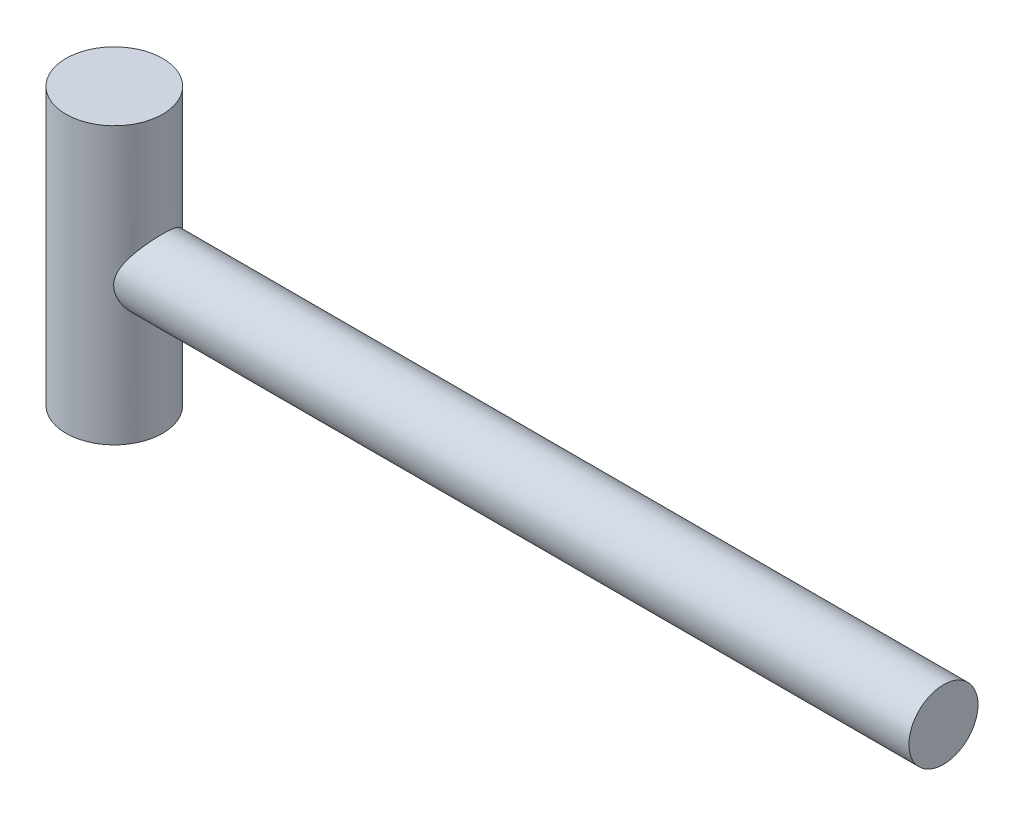
ISO-10303-21;
HEADER;
FILE_DESCRIPTION(('STEP AP214'),'2;1');
FILE_NAME('part.step','',(''),(''),'','','');
FILE_SCHEMA(('AUTOMOTIVE_DESIGN { 1 0 10303 214 1 1 1 1 }'));
ENDSEC;
DATA;
#1=APPLICATION_CONTEXT('core data for automotive mechanical design processes');
#2=APPLICATION_PROTOCOL_DEFINITION('international standard','automotive_design',2000,#1);
#3=PRODUCT_CONTEXT('',#1,'mechanical');
#4=PRODUCT('Part','Part','',(#3));
#5=PRODUCT_RELATED_PRODUCT_CATEGORY('part','',(#4));
#6=PRODUCT_DEFINITION_FORMATION('','',#4);
#7=PRODUCT_DEFINITION_CONTEXT('part definition',#1,'design');
#8=PRODUCT_DEFINITION('design','',#6,#7);
#9=PRODUCT_DEFINITION_SHAPE('','',#8);
#10=(LENGTH_UNIT() NAMED_UNIT(*) SI_UNIT(.MILLI.,.METRE.));
#11=(NAMED_UNIT(*) PLANE_ANGLE_UNIT() SI_UNIT($,.RADIAN.));
#12=(NAMED_UNIT(*) SI_UNIT($,.STERADIAN.) SOLID_ANGLE_UNIT());
#13=UNCERTAINTY_MEASURE_WITH_UNIT(LENGTH_MEASURE(1.E-05),#10,'distance_accuracy_value','');
#14=(GEOMETRIC_REPRESENTATION_CONTEXT(3) GLOBAL_UNCERTAINTY_ASSIGNED_CONTEXT((#13)) GLOBAL_UNIT_ASSIGNED_CONTEXT((#10,
#11,#12)) REPRESENTATION_CONTEXT('',''));
#15=CARTESIAN_POINT('',(0.,0.,0.));
#16=DIRECTION('',(0.,0.,1.));
#17=DIRECTION('',(1.,0.,0.));
#18=AXIS2_PLACEMENT_3D('',#15,#16,#17);
#19=CARTESIAN_POINT('',(0.,5.,0.));
#20=DIRECTION('',(0.,-1.,0.));
#21=DIRECTION('',(0.,0.,-1.));
#22=AXIS2_PLACEMENT_3D('',#19,#20,#21);
#23=CYLINDRICAL_SURFACE('',#22,1.75);
#24=CARTESIAN_POINT('',(0.,5.,0.));
#25=DIRECTION('',(0.,1.,0.));
#26=DIRECTION('',(0.,0.,1.));
#27=AXIS2_PLACEMENT_3D('',#24,#25,#26);
#28=CIRCLE('',#27,1.75);
#29=CARTESIAN_POINT('',(0.,5.,1.75));
#30=VERTEX_POINT('',#29);
#31=EDGE_CURVE('E55',#30,#30,#28,.T.);
#32=ORIENTED_EDGE('',*,*,#31,.F.);
#33=EDGE_LOOP('',(#32));
#34=FACE_BOUND('',#33,.T.);
#35=CARTESIAN_POINT('',(0.,-5.,0.));
#36=DIRECTION('',(0.,1.,0.));
#37=DIRECTION('',(0.,0.,1.));
#38=AXIS2_PLACEMENT_3D('',#35,#36,#37);
#39=CIRCLE('',#38,1.75);
#40=CARTESIAN_POINT('',(0.,-5.,1.75));
#41=VERTEX_POINT('',#40);
#42=EDGE_CURVE('E60',#41,#41,#39,.T.);
#43=ORIENTED_EDGE('',*,*,#42,.T.);
#44=EDGE_LOOP('',(#43));
#45=FACE_BOUND('',#44,.T.);
#46=CARTESIAN_POINT('',(1.22474487139159,0.,1.25));
#47=CARTESIAN_POINT('',(1.22474304942473,-0.0595529696782451,1.25000113878815));
#48=CARTESIAN_POINT('',(1.22917443864513,-0.119100616930046,1.24570473720215));
#49=CARTESIAN_POINT('',(1.24591481785065,-0.235958461148627,1.2289534458233));
#50=CARTESIAN_POINT('',(1.25824319848623,-0.293262781204082,1.21647847219764));
#51=CARTESIAN_POINT('',(1.28840575797274,-0.40345879830746,1.18447536214374));
#52=CARTESIAN_POINT('',(1.30617372652521,-0.456394334207042,1.16503158830197));
#53=CARTESIAN_POINT('',(1.34509448521861,-0.558112013949313,1.11987035037745));
#54=CARTESIAN_POINT('',(1.36624714352945,-0.606894319442639,1.09415313061839));
#55=CARTESIAN_POINT('',(1.41419933901286,-0.708758137960503,1.03167862473772));
#56=CARTESIAN_POINT('',(1.44132123555464,-0.760975802491956,0.993760266149209));
#57=CARTESIAN_POINT('',(1.49544568021096,-0.859085895700566,0.910288078591556));
#58=CARTESIAN_POINT('',(1.52244802121667,-0.904969805964378,0.864724145806571));
#59=CARTESIAN_POINT('',(1.57887045348912,-0.99718991063633,0.757595099069316));
#60=CARTESIAN_POINT('',(1.60787500231288,-1.04217413037939,0.694625209449819));
#61=CARTESIAN_POINT('',(1.65969615836735,-1.12046807396806,0.559559320060222));
#62=CARTESIAN_POINT('',(1.68252575403928,-1.1538023462554,0.487482951217853));
#63=CARTESIAN_POINT('',(1.71404781599875,-1.19922620192138,0.357353045469455));
#64=CARTESIAN_POINT('',(1.72490637912273,-1.21464623678663,0.30097762456184));
#65=CARTESIAN_POINT('',(1.74106896215847,-1.23749263841917,0.185864188024748));
#66=CARTESIAN_POINT('',(1.7463775224548,-1.24492553949464,0.127128144508455));
#67=CARTESIAN_POINT('',(1.75098078363936,-1.25137474712601,0.00883102684159252));
#68=CARTESIAN_POINT('',(1.75026273160014,-1.25037320552428,-0.0507315304516833));
#69=CARTESIAN_POINT('',(1.74284917113415,-1.23997431334383,-0.168743379715217));
#70=CARTESIAN_POINT('',(1.73615206962108,-1.23057472514928,-0.227192370742192));
#71=CARTESIAN_POINT('',(1.71760943890499,-1.20426996399424,-0.339846831807772));
#72=CARTESIAN_POINT('',(1.70590219385611,-1.18756614171022,-0.394123099462758));
#73=CARTESIAN_POINT('',(1.67823597889748,-1.14746944091579,-0.498966386132505));
#74=CARTESIAN_POINT('',(1.66227614417991,-1.12407520176934,-0.549532648008918));
#75=CARTESIAN_POINT('',(1.62515356801652,-1.0684574118156,-0.651649596599107));
#76=CARTESIAN_POINT('',(1.60360910456743,-1.03554020379504,-0.702681303115436));
#77=CARTESIAN_POINT('',(1.5579707747488,-0.963356325186894,-0.798788868913126));
#78=CARTESIAN_POINT('',(1.5338743321405,-0.924083216750892,-0.843858604339025));
#79=CARTESIAN_POINT('',(1.48011653767395,-0.832101190840163,-0.935449662778367));
#80=CARTESIAN_POINT('',(1.45024852851582,-0.778250175833641,-0.980705442306912));
#81=CARTESIAN_POINT('',(1.39189826122174,-0.6632068557331,-1.06189134270194));
#82=CARTESIAN_POINT('',(1.36341592646842,-0.602014957184694,-1.09782197965601));
#83=CARTESIAN_POINT('',(1.31731476668484,-0.48725107545651,-1.15245853194151));
#84=CARTESIAN_POINT('',(1.29869408947577,-0.435067729520885,-1.17322129824346));
#85=CARTESIAN_POINT('',(1.26659436569089,-0.326972230852882,-1.20780686876608));
#86=CARTESIAN_POINT('',(1.25310581265891,-0.27106719999139,-1.22164251955588));
#87=CARTESIAN_POINT('',(1.23331539864056,-0.155887560382301,-1.24162966167527));
#88=CARTESIAN_POINT('',(1.22709868380631,-0.0965813966464914,-1.24769019185046));
#89=CARTESIAN_POINT('',(1.22350980887168,0.022540864658391,-1.25121316951412));
#90=CARTESIAN_POINT('',(1.22613134562694,0.0823565684859932,-1.24868174448796));
#91=CARTESIAN_POINT('',(1.23851495876392,0.190695231776886,-1.23637869315102));
#92=CARTESIAN_POINT('',(1.24708266381058,0.239508515729787,-1.22781494161703));
#93=CARTESIAN_POINT('',(1.26883815751193,0.334823772020313,-1.20531933940302));
#94=CARTESIAN_POINT('',(1.28203138231868,0.381322950950572,-1.19138117049528));
#95=CARTESIAN_POINT('',(1.31878409019689,0.493130361076649,-1.1508111923713));
#96=CARTESIAN_POINT('',(1.34427958163588,0.556752666059566,-1.12129781282337));
#97=CARTESIAN_POINT('',(1.39849427702861,0.677268593657933,-1.05291275263757));
#98=CARTESIAN_POINT('',(1.42721987159609,0.734148403349365,-1.01402233973727));
#99=CARTESIAN_POINT('',(1.48553249506883,0.841962967833543,-0.926563955590026));
#100=CARTESIAN_POINT('',(1.51512429016922,0.892733723629586,-0.877796588036531));
#101=CARTESIAN_POINT('',(1.57183184147132,0.985908915065174,-0.771658432520618));
#102=CARTESIAN_POINT('',(1.59895098178446,1.02832488039249,-0.714299696045287));
#103=CARTESIAN_POINT('',(1.64463079610222,1.09790223663628,-0.600718392183554));
#104=CARTESIAN_POINT('',(1.66386413121549,1.12639235631378,-0.545584827356541));
#105=CARTESIAN_POINT('',(1.6973100250272,1.17523569953207,-0.43038048992974));
#106=CARTESIAN_POINT('',(1.71152543943879,1.19559355204096,-0.370312549570804));
#107=CARTESIAN_POINT('',(1.73373829244317,1.2271821693469,-0.246256922018859));
#108=CARTESIAN_POINT('',(1.74169567602367,1.23835415968288,-0.182246767675134));
#109=CARTESIAN_POINT('',(1.75040379647474,1.2505730638589,-0.0527878751330795));
#110=CARTESIAN_POINT('',(1.7511583293449,1.25162531094248,0.0126600870898969));
#111=CARTESIAN_POINT('',(1.74570783631181,1.24398555486539,0.135574668461611));
#112=CARTESIAN_POINT('',(1.74024169492608,1.23632813056228,0.193143439949369));
#113=CARTESIAN_POINT('',(1.72399204869256,1.21334846652497,0.305940290579476));
#114=CARTESIAN_POINT('',(1.71320764185132,1.19802492658861,0.361167970939796));
#115=CARTESIAN_POINT('',(1.68683740983549,1.16000527884499,0.469311091958666));
#116=CARTESIAN_POINT('',(1.67114466452118,1.13714431228782,0.52214164692364));
#117=CARTESIAN_POINT('',(1.63614048686511,1.08504718993276,0.623225075594567));
#118=CARTESIAN_POINT('',(1.61682838671011,1.05580985745769,0.671477102029682));
#119=CARTESIAN_POINT('',(1.5725656330192,0.986798697563335,0.769989132712431));
#120=CARTESIAN_POINT('',(1.54720469518571,0.946095412070817,0.819412079712614));
#121=CARTESIAN_POINT('',(1.49499922171894,0.858067738437003,0.911193407383643));
#122=CARTESIAN_POINT('',(1.46815199424041,0.810731082278037,0.953538372109418));
#123=CARTESIAN_POINT('',(1.41042902347451,0.701316740213476,1.03739942970278));
#124=CARTESIAN_POINT('',(1.37965522518731,0.638104183525541,1.077518445657));
#125=CARTESIAN_POINT('',(1.32292539848802,0.503798658153662,1.14645501932956));
#126=CARTESIAN_POINT('',(1.29696081961031,0.43272004144862,1.17529273798407));
#127=CARTESIAN_POINT('',(1.2601076459367,0.301377161568214,1.21457067763706));
#128=CARTESIAN_POINT('',(1.24710326277072,0.24255215163524,1.227753345597));
#129=CARTESIAN_POINT('',(1.22943592627246,0.122477385789558,1.24545379709728));
#130=CARTESIAN_POINT('',(1.22474674484548,0.0612358791497471,1.2499988290308));
#131=CARTESIAN_POINT('',(1.22474487139159,0.,1.25));
#132=B_SPLINE_CURVE_WITH_KNOTS('',3,(#46,#47,#48,#49,#50,#51,#52,#53,#54,#55,#56,#57,#58,#59,
#60,#61,#62,#63,#64,#65,#66,#67,#68,#69,#70,#71,#72,#73,#74,#75,#76,#77,#78,#79,#80,#81,#82,#83,
#84,#85,#86,#87,#88,#89,#90,#91,#92,#93,#94,#95,#96,#97,#98,#99,#100,#101,#102,#103,#104,#105,
#106,#107,#108,#109,#110,#111,#112,#113,#114,#115,#116,#117,#118,#119,#120,#121,#122,#123,#124,
#125,#126,#127,#128,#129,#130,#131),.UNSPECIFIED.,.T.,.F.,(4,2,2,2,2,2,2,2,2,2,2,2,2,2,2,2,2,2,
2,2,2,2,2,2,2,2,2,2,2,2,2,2,2,2,2,2,2,2,2,2,2,2,4),(0.,0.178367784638105,0.357175229760188,
0.53388739300157,0.710592675164261,0.919854777961744,1.12939563579317,1.37595259129664,
1.62198683129379,1.79956585644296,1.97699949256987,2.1548086909123,2.3326652797242,
2.50590090440653,2.67917178525672,2.87176390396011,3.06455233307616,3.29289976439196,
3.52123455542721,3.69813355343157,3.87470325971262,4.0533203624292,4.23181010837765,
4.3820823027899,4.53253170023111,4.75520182003367,4.97832050243919,5.20649708707211,
5.43435654517519,5.62848173291277,5.82249626465274,6.01774271786101,6.21288626786733,
6.3870676323335,6.56127854863694,6.73958514545461,6.91792467436985,7.12375540297224,
7.3299719543365,7.5716815540498,7.81295719657677,7.99694686855663,8.18035515471464),.UNSPECIFIED.);
#133=CARTESIAN_POINT('',(1.22474487139159,0.,1.25));
#134=VERTEX_POINT('',#133);
#135=EDGE_CURVE('E10',#134,#134,#132,.T.);
#136=ORIENTED_EDGE('',*,*,#135,.F.);
#137=EDGE_LOOP('',(#136));
#138=FACE_BOUND('',#137,.T.);
#139=ADVANCED_FACE('F43',(#34,#45,#138),#23,.T.);
#140=CARTESIAN_POINT('',(0.,5.,0.));
#141=DIRECTION('',(0.,1.,0.));
#142=DIRECTION('',(0.,0.,1.));
#143=AXIS2_PLACEMENT_3D('',#140,#141,#142);
#144=PLANE('',#143);
#145=ORIENTED_EDGE('',*,*,#31,.T.);
#146=EDGE_LOOP('',(#145));
#147=FACE_BOUND('',#146,.T.);
#148=ADVANCED_FACE('F83',(#147),#144,.T.);
#149=CARTESIAN_POINT('',(0.,-5.,0.));
#150=DIRECTION('',(0.,1.,0.));
#151=DIRECTION('',(0.,0.,1.));
#152=AXIS2_PLACEMENT_3D('',#149,#150,#151);
#153=PLANE('',#152);
#154=ORIENTED_EDGE('',*,*,#42,.F.);
#155=EDGE_LOOP('',(#154));
#156=FACE_BOUND('',#155,.T.);
#157=ADVANCED_FACE('F76',(#156),#153,.F.);
#158=CARTESIAN_POINT('',(30.,0.,0.));
#159=DIRECTION('',(-1.,0.,0.));
#160=DIRECTION('',(0.,0.,1.));
#161=AXIS2_PLACEMENT_3D('',#158,#159,#160);
#162=CYLINDRICAL_SURFACE('',#161,1.25);
#163=CARTESIAN_POINT('',(30.,0.,0.));
#164=DIRECTION('',(1.,0.,0.));
#165=DIRECTION('',(0.,0.,-1.));
#166=AXIS2_PLACEMENT_3D('',#163,#164,#165);
#167=CIRCLE('',#166,1.25);
#168=CARTESIAN_POINT('',(30.,0.,-1.25));
#169=VERTEX_POINT('',#168);
#170=EDGE_CURVE('E66',#169,#169,#167,.T.);
#171=ORIENTED_EDGE('',*,*,#170,.F.);
#172=EDGE_LOOP('',(#171));
#173=FACE_BOUND('',#172,.T.);
#174=ORIENTED_EDGE('',*,*,#135,.T.);
#175=EDGE_LOOP('',(#174));
#176=FACE_BOUND('',#175,.T.);
#177=ADVANCED_FACE('F74',(#173,#176),#162,.T.);
#178=CARTESIAN_POINT('',(30.,0.,0.));
#179=DIRECTION('',(1.,0.,0.));
#180=DIRECTION('',(0.,0.,-1.));
#181=AXIS2_PLACEMENT_3D('',#178,#179,#180);
#182=PLANE('',#181);
#183=ORIENTED_EDGE('',*,*,#170,.T.);
#184=EDGE_LOOP('',(#183));
#185=FACE_BOUND('',#184,.T.);
#186=ADVANCED_FACE('F72',(#185),#182,.T.);
#187=CLOSED_SHELL('',(#139,#148,#157,#177,#186));
#188=MANIFOLD_SOLID_BREP('B2',#187);
#189=ADVANCED_BREP_SHAPE_REPRESENTATION('',(#18,#188),#14);
#190=SHAPE_DEFINITION_REPRESENTATION(#9,#189);
ENDSEC;
END-ISO-10303-21;
